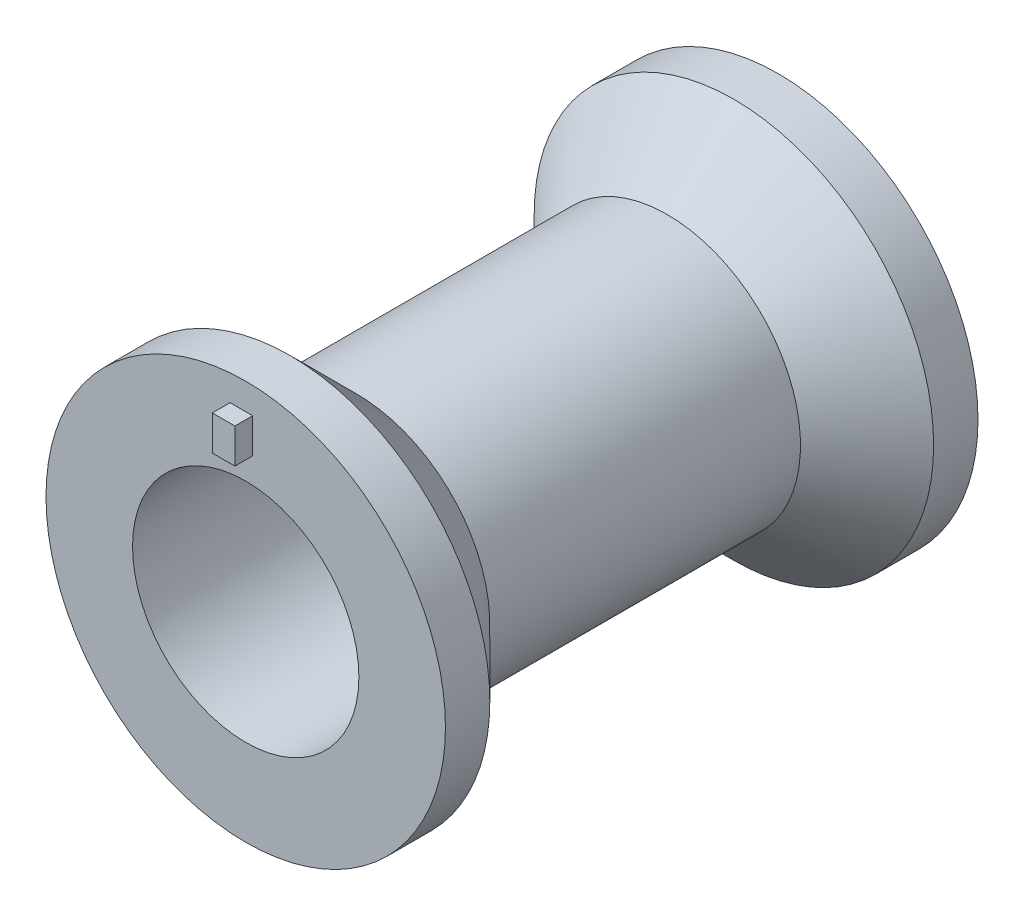
ISO-10303-21;
HEADER;
FILE_DESCRIPTION(('STEP AP214'),'2;1');
FILE_NAME('part.step','',(''),(''),'','','');
FILE_SCHEMA(('AUTOMOTIVE_DESIGN { 1 0 10303 214 1 1 1 1 }'));
ENDSEC;
DATA;
#1=APPLICATION_CONTEXT('core data for automotive mechanical design processes');
#2=APPLICATION_PROTOCOL_DEFINITION('international standard','automotive_design',2000,#1);
#3=PRODUCT_CONTEXT('',#1,'mechanical');
#4=PRODUCT('Part','Part','',(#3));
#5=PRODUCT_RELATED_PRODUCT_CATEGORY('part','',(#4));
#6=PRODUCT_DEFINITION_FORMATION('','',#4);
#7=PRODUCT_DEFINITION_CONTEXT('part definition',#1,'design');
#8=PRODUCT_DEFINITION('design','',#6,#7);
#9=PRODUCT_DEFINITION_SHAPE('','',#8);
#10=(LENGTH_UNIT() NAMED_UNIT(*) SI_UNIT(.MILLI.,.METRE.));
#11=(NAMED_UNIT(*) PLANE_ANGLE_UNIT() SI_UNIT($,.RADIAN.));
#12=(NAMED_UNIT(*) SI_UNIT($,.STERADIAN.) SOLID_ANGLE_UNIT());
#13=UNCERTAINTY_MEASURE_WITH_UNIT(LENGTH_MEASURE(1.E-05),#10,'distance_accuracy_value','');
#14=(GEOMETRIC_REPRESENTATION_CONTEXT(3) GLOBAL_UNCERTAINTY_ASSIGNED_CONTEXT((#13)) GLOBAL_UNIT_ASSIGNED_CONTEXT((#10,
#11,#12)) REPRESENTATION_CONTEXT('',''));
#15=CARTESIAN_POINT('',(0.,0.,0.));
#16=DIRECTION('',(0.,0.,1.));
#17=DIRECTION('',(1.,0.,0.));
#18=AXIS2_PLACEMENT_3D('',#15,#16,#17);
#19=CARTESIAN_POINT('',(0.,0.,60.));
#20=DIRECTION('',(0.,0.,1.));
#21=DIRECTION('',(1.,0.,0.));
#22=AXIS2_PLACEMENT_3D('',#19,#20,#21);
#23=PLANE('',#22);
#24=CARTESIAN_POINT('',(0.,0.,60.));
#25=DIRECTION('',(0.,0.,1.));
#26=DIRECTION('',(1.,0.,0.));
#27=AXIS2_PLACEMENT_3D('',#24,#25,#26);
#28=CIRCLE('',#27,22.5);
#29=CARTESIAN_POINT('',(22.5,0.,60.));
#30=VERTEX_POINT('',#29);
#31=EDGE_CURVE('E11',#30,#30,#28,.T.);
#32=ORIENTED_EDGE('',*,*,#31,.T.);
#33=EDGE_LOOP('',(#32));
#34=FACE_BOUND('',#33,.T.);
#35=CARTESIAN_POINT('',(0.,0.,60.));
#36=DIRECTION('',(0.,0.,1.));
#37=DIRECTION('',(1.,0.,0.));
#38=AXIS2_PLACEMENT_3D('',#35,#36,#37);
#39=CIRCLE('',#38,12.75);
#40=CARTESIAN_POINT('',(12.75,0.,60.));
#41=VERTEX_POINT('',#40);
#42=EDGE_CURVE('E129',#41,#41,#39,.T.);
#43=ORIENTED_EDGE('',*,*,#42,.F.);
#44=EDGE_LOOP('',(#43));
#45=FACE_BOUND('',#44,.T.);
#46=DIRECTION('',(0.,-1.,0.));
#47=VECTOR('',#46,1.);
#48=CARTESIAN_POINT('',(-1.7622583013788,19.515378967121,60.));
#49=LINE('',#48,#47);
#50=CARTESIAN_POINT('',(-1.7622583013788,19.515378967121,60.));
#51=VERTEX_POINT('',#50);
#52=CARTESIAN_POINT('',(-1.7622583013788,15.5992494085014,60.));
#53=VERTEX_POINT('',#52);
#54=EDGE_CURVE('E95',#51,#53,#49,.T.);
#55=ORIENTED_EDGE('',*,*,#54,.F.);
#56=DIRECTION('',(-1.,0.,0.));
#57=VECTOR('',#56,1.);
#58=CARTESIAN_POINT('',(-1.7622583013788,19.515378967121,60.));
#59=LINE('',#58,#57);
#60=CARTESIAN_POINT('',(0.783225911723917,19.515378967121,60.));
#61=VERTEX_POINT('',#60);
#62=EDGE_CURVE('E106',#61,#51,#59,.T.);
#63=ORIENTED_EDGE('',*,*,#62,.F.);
#64=DIRECTION('',(0.,1.,0.));
#65=VECTOR('',#64,1.);
#66=CARTESIAN_POINT('',(0.783225911723917,19.515378967121,60.));
#67=LINE('',#66,#65);
#68=CARTESIAN_POINT('',(0.783225911723917,15.5992494085014,60.));
#69=VERTEX_POINT('',#68);
#70=EDGE_CURVE('E76',#69,#61,#67,.T.);
#71=ORIENTED_EDGE('',*,*,#70,.F.);
#72=DIRECTION('',(1.,0.,0.));
#73=VECTOR('',#72,1.);
#74=CARTESIAN_POINT('',(-1.7622583013788,15.5992494085014,60.));
#75=LINE('',#74,#73);
#76=EDGE_CURVE('E110',#53,#69,#75,.T.);
#77=ORIENTED_EDGE('',*,*,#76,.F.);
#78=EDGE_LOOP('',(#55,#63,#71,#77));
#79=FACE_BOUND('',#78,.T.);
#80=ADVANCED_FACE('F39',(#34,#45,#79),#23,.T.);
#81=CARTESIAN_POINT('',(0.,0.,60.));
#82=DIRECTION('',(0.,0.,-1.));
#83=DIRECTION('',(-1.,0.,0.));
#84=AXIS2_PLACEMENT_3D('',#81,#82,#83);
#85=CYLINDRICAL_SURFACE('',#84,22.5);
#86=CARTESIAN_POINT('',(0.,0.,0.));
#87=DIRECTION('',(0.,0.,1.));
#88=DIRECTION('',(1.,0.,0.));
#89=AXIS2_PLACEMENT_3D('',#86,#87,#88);
#90=CIRCLE('',#89,22.5);
#91=CARTESIAN_POINT('',(22.5,0.,0.));
#92=VERTEX_POINT('',#91);
#93=EDGE_CURVE('E43',#92,#92,#90,.T.);
#94=ORIENTED_EDGE('',*,*,#93,.T.);
#95=EDGE_LOOP('',(#94));
#96=FACE_BOUND('',#95,.T.);
#97=CARTESIAN_POINT('',(0.,0.,5.));
#98=DIRECTION('',(0.,0.,-1.));
#99=DIRECTION('',(-1.,0.,0.));
#100=AXIS2_PLACEMENT_3D('',#97,#98,#99);
#101=CIRCLE('',#100,22.5);
#102=CARTESIAN_POINT('',(-22.5,0.,5.));
#103=VERTEX_POINT('',#102);
#104=EDGE_CURVE('E116',#103,#103,#101,.T.);
#105=ORIENTED_EDGE('',*,*,#104,.T.);
#106=EDGE_LOOP('',(#105));
#107=FACE_BOUND('',#106,.T.);
#108=ADVANCED_FACE('F41',(#96,#107),#85,.T.);
#109=ORIENTED_EDGE('',*,*,#31,.F.);
#110=EDGE_LOOP('',(#109));
#111=FACE_BOUND('',#110,.T.);
#112=CARTESIAN_POINT('',(0.,0.,55.));
#113=DIRECTION('',(0.,0.,-1.));
#114=DIRECTION('',(-1.,0.,0.));
#115=AXIS2_PLACEMENT_3D('',#112,#113,#114);
#116=CIRCLE('',#115,22.5);
#117=CARTESIAN_POINT('',(-22.5,0.,55.));
#118=VERTEX_POINT('',#117);
#119=EDGE_CURVE('E119',#118,#118,#116,.T.);
#120=ORIENTED_EDGE('',*,*,#119,.F.);
#121=EDGE_LOOP('',(#120));
#122=FACE_BOUND('',#121,.T.);
#123=ADVANCED_FACE('F150',(#111,#122),#85,.T.);
#124=CARTESIAN_POINT('',(0.,0.,0.));
#125=DIRECTION('',(0.,0.,1.));
#126=DIRECTION('',(1.,0.,0.));
#127=AXIS2_PLACEMENT_3D('',#124,#125,#126);
#128=PLANE('',#127);
#129=ORIENTED_EDGE('',*,*,#93,.F.);
#130=EDGE_LOOP('',(#129));
#131=FACE_BOUND('',#130,.T.);
#132=CARTESIAN_POINT('',(0.,0.,0.));
#133=DIRECTION('',(0.,0.,1.));
#134=DIRECTION('',(1.,0.,0.));
#135=AXIS2_PLACEMENT_3D('',#132,#133,#134);
#136=CIRCLE('',#135,12.75);
#137=CARTESIAN_POINT('',(12.75,0.,0.));
#138=VERTEX_POINT('',#137);
#139=EDGE_CURVE('E128',#138,#138,#136,.T.);
#140=ORIENTED_EDGE('',*,*,#139,.T.);
#141=EDGE_LOOP('',(#140));
#142=FACE_BOUND('',#141,.T.);
#143=ADVANCED_FACE('F135',(#131,#142),#128,.F.);
#144=CARTESIAN_POINT('',(0.,0.,60.));
#145=DIRECTION('',(0.,0.,-1.));
#146=DIRECTION('',(-1.,0.,0.));
#147=AXIS2_PLACEMENT_3D('',#144,#145,#146);
#148=CYLINDRICAL_SURFACE('',#147,12.75);
#149=ORIENTED_EDGE('',*,*,#42,.T.);
#150=EDGE_LOOP('',(#149));
#151=FACE_BOUND('',#150,.T.);
#152=ORIENTED_EDGE('',*,*,#139,.F.);
#153=EDGE_LOOP('',(#152));
#154=FACE_BOUND('',#153,.T.);
#155=ADVANCED_FACE('F137',(#151,#154),#148,.F.);
#156=CARTESIAN_POINT('',(0.,0.,5.));
#157=DIRECTION('',(0.,0.,-1.));
#158=DIRECTION('',(-1.,0.,0.));
#159=AXIS2_PLACEMENT_3D('',#156,#157,#158);
#160=CONICAL_SURFACE('',#159,22.5,0.785398163397449);
#161=CARTESIAN_POINT('',(0.,0.,12.5));
#162=DIRECTION('',(0.,0.,-1.));
#163=DIRECTION('',(-1.,0.,0.));
#164=AXIS2_PLACEMENT_3D('',#161,#162,#163);
#165=CIRCLE('',#164,15.);
#166=CARTESIAN_POINT('',(-15.,0.,12.5));
#167=VERTEX_POINT('',#166);
#168=EDGE_CURVE('E125',#167,#167,#165,.T.);
#169=ORIENTED_EDGE('',*,*,#168,.T.);
#170=EDGE_LOOP('',(#169));
#171=FACE_BOUND('',#170,.T.);
#172=ORIENTED_EDGE('',*,*,#104,.F.);
#173=EDGE_LOOP('',(#172));
#174=FACE_BOUND('',#173,.T.);
#175=ADVANCED_FACE('F139',(#171,#174),#160,.T.);
#176=CARTESIAN_POINT('',(0.,0.,-10.7965021339282));
#177=DIRECTION('',(0.,0.,-1.));
#178=DIRECTION('',(-1.,0.,0.));
#179=AXIS2_PLACEMENT_3D('',#176,#177,#178);
#180=CYLINDRICAL_SURFACE('',#179,15.);
#181=CARTESIAN_POINT('',(0.,0.,47.5));
#182=DIRECTION('',(0.,0.,-1.));
#183=DIRECTION('',(-1.,0.,0.));
#184=AXIS2_PLACEMENT_3D('',#181,#182,#183);
#185=CIRCLE('',#184,15.);
#186=CARTESIAN_POINT('',(-15.,0.,47.5));
#187=VERTEX_POINT('',#186);
#188=EDGE_CURVE('E122',#187,#187,#185,.T.);
#189=ORIENTED_EDGE('',*,*,#188,.T.);
#190=EDGE_LOOP('',(#189));
#191=FACE_BOUND('',#190,.T.);
#192=ORIENTED_EDGE('',*,*,#168,.F.);
#193=EDGE_LOOP('',(#192));
#194=FACE_BOUND('',#193,.T.);
#195=ADVANCED_FACE('F147',(#191,#194),#180,.T.);
#196=CARTESIAN_POINT('',(0.,0.,47.5));
#197=DIRECTION('',(0.,0.,1.));
#198=DIRECTION('',(1.,0.,0.));
#199=AXIS2_PLACEMENT_3D('',#196,#197,#198);
#200=CONICAL_SURFACE('',#199,15.,0.785398163397449);
#201=ORIENTED_EDGE('',*,*,#119,.T.);
#202=EDGE_LOOP('',(#201));
#203=FACE_BOUND('',#202,.T.);
#204=ORIENTED_EDGE('',*,*,#188,.F.);
#205=EDGE_LOOP('',(#204));
#206=FACE_BOUND('',#205,.T.);
#207=ADVANCED_FACE('F180',(#203,#206),#200,.T.);
#208=CARTESIAN_POINT('',(-1.7622583013788,19.515378967121,62.));
#209=DIRECTION('',(0.,-1.,0.));
#210=DIRECTION('',(0.,0.,-1.));
#211=AXIS2_PLACEMENT_3D('',#208,#209,#210);
#212=PLANE('',#211);
#213=ORIENTED_EDGE('',*,*,#62,.T.);
#214=DIRECTION('',(0.,0.,-1.));
#215=VECTOR('',#214,1.);
#216=CARTESIAN_POINT('',(-1.7622583013788,19.515378967121,62.));
#217=LINE('',#216,#215);
#218=CARTESIAN_POINT('',(-1.7622583013788,19.515378967121,62.));
#219=VERTEX_POINT('',#218);
#220=EDGE_CURVE('E98',#219,#51,#217,.T.);
#221=ORIENTED_EDGE('',*,*,#220,.F.);
#222=DIRECTION('',(-1.,0.,0.));
#223=VECTOR('',#222,1.);
#224=CARTESIAN_POINT('',(-1.7622583013788,19.515378967121,62.));
#225=LINE('',#224,#223);
#226=CARTESIAN_POINT('',(0.783225911723917,19.515378967121,62.));
#227=VERTEX_POINT('',#226);
#228=EDGE_CURVE('E88',#227,#219,#225,.T.);
#229=ORIENTED_EDGE('',*,*,#228,.F.);
#230=DIRECTION('',(0.,0.,-1.));
#231=VECTOR('',#230,1.);
#232=CARTESIAN_POINT('',(0.783225911723917,19.515378967121,62.));
#233=LINE('',#232,#231);
#234=EDGE_CURVE('E102',#227,#61,#233,.T.);
#235=ORIENTED_EDGE('',*,*,#234,.T.);
#236=EDGE_LOOP('',(#213,#221,#229,#235));
#237=FACE_BOUND('',#236,.T.);
#238=ADVANCED_FACE('F166',(#237),#212,.F.);
#239=CARTESIAN_POINT('',(-1.7622583013788,19.515378967121,62.));
#240=DIRECTION('',(1.,0.,0.));
#241=DIRECTION('',(0.,0.,-1.));
#242=AXIS2_PLACEMENT_3D('',#239,#240,#241);
#243=PLANE('',#242);
#244=ORIENTED_EDGE('',*,*,#54,.T.);
#245=DIRECTION('',(0.,0.,-1.));
#246=VECTOR('',#245,1.);
#247=CARTESIAN_POINT('',(-1.7622583013788,15.5992494085014,62.));
#248=LINE('',#247,#246);
#249=CARTESIAN_POINT('',(-1.7622583013788,15.5992494085014,62.));
#250=VERTEX_POINT('',#249);
#251=EDGE_CURVE('E92',#250,#53,#248,.T.);
#252=ORIENTED_EDGE('',*,*,#251,.F.);
#253=DIRECTION('',(0.,-1.,0.));
#254=VECTOR('',#253,1.);
#255=CARTESIAN_POINT('',(-1.7622583013788,19.515378967121,62.));
#256=LINE('',#255,#254);
#257=EDGE_CURVE('E83',#219,#250,#256,.T.);
#258=ORIENTED_EDGE('',*,*,#257,.F.);
#259=ORIENTED_EDGE('',*,*,#220,.T.);
#260=EDGE_LOOP('',(#244,#252,#258,#259));
#261=FACE_BOUND('',#260,.T.);
#262=ADVANCED_FACE('F93',(#261),#243,.F.);
#263=CARTESIAN_POINT('',(-1.7622583013788,15.5992494085014,62.));
#264=DIRECTION('',(0.,1.,0.));
#265=DIRECTION('',(0.,0.,1.));
#266=AXIS2_PLACEMENT_3D('',#263,#264,#265);
#267=PLANE('',#266);
#268=ORIENTED_EDGE('',*,*,#76,.T.);
#269=DIRECTION('',(0.,0.,-1.));
#270=VECTOR('',#269,1.);
#271=CARTESIAN_POINT('',(0.783225911723917,15.5992494085014,62.));
#272=LINE('',#271,#270);
#273=CARTESIAN_POINT('',(0.783225911723917,15.5992494085014,62.));
#274=VERTEX_POINT('',#273);
#275=EDGE_CURVE('E54',#274,#69,#272,.T.);
#276=ORIENTED_EDGE('',*,*,#275,.F.);
#277=DIRECTION('',(1.,0.,0.));
#278=VECTOR('',#277,1.);
#279=CARTESIAN_POINT('',(-1.7622583013788,15.5992494085014,62.));
#280=LINE('',#279,#278);
#281=EDGE_CURVE('E86',#250,#274,#280,.T.);
#282=ORIENTED_EDGE('',*,*,#281,.F.);
#283=ORIENTED_EDGE('',*,*,#251,.T.);
#284=EDGE_LOOP('',(#268,#276,#282,#283));
#285=FACE_BOUND('',#284,.T.);
#286=ADVANCED_FACE('F100',(#285),#267,.F.);
#287=CARTESIAN_POINT('',(0.783225911723917,19.515378967121,62.));
#288=DIRECTION('',(-1.,0.,0.));
#289=DIRECTION('',(0.,0.,1.));
#290=AXIS2_PLACEMENT_3D('',#287,#288,#289);
#291=PLANE('',#290);
#292=ORIENTED_EDGE('',*,*,#70,.T.);
#293=ORIENTED_EDGE('',*,*,#234,.F.);
#294=DIRECTION('',(0.,1.,0.));
#295=VECTOR('',#294,1.);
#296=CARTESIAN_POINT('',(0.783225911723917,19.515378967121,62.));
#297=LINE('',#296,#295);
#298=EDGE_CURVE('E62',#274,#227,#297,.T.);
#299=ORIENTED_EDGE('',*,*,#298,.F.);
#300=ORIENTED_EDGE('',*,*,#275,.T.);
#301=EDGE_LOOP('',(#292,#293,#299,#300));
#302=FACE_BOUND('',#301,.T.);
#303=ADVANCED_FACE('F167',(#302),#291,.F.);
#304=CARTESIAN_POINT('',(0.,0.,62.));
#305=DIRECTION('',(0.,0.,-1.));
#306=DIRECTION('',(-1.,0.,0.));
#307=AXIS2_PLACEMENT_3D('',#304,#305,#306);
#308=PLANE('',#307);
#309=ORIENTED_EDGE('',*,*,#228,.T.);
#310=ORIENTED_EDGE('',*,*,#257,.T.);
#311=ORIENTED_EDGE('',*,*,#281,.T.);
#312=ORIENTED_EDGE('',*,*,#298,.T.);
#313=EDGE_LOOP('',(#309,#310,#311,#312));
#314=FACE_BOUND('',#313,.T.);
#315=ADVANCED_FACE('F84',(#314),#308,.F.);
#316=CLOSED_SHELL('',(#80,#108,#123,#143,#155,#175,#195,#207,#238,#262,#286,#303,#315));
#317=MANIFOLD_SOLID_BREP('B2',#316);
#318=ADVANCED_BREP_SHAPE_REPRESENTATION('',(#18,#317),#14);
#319=SHAPE_DEFINITION_REPRESENTATION(#9,#318);
ENDSEC;
END-ISO-10303-21;
